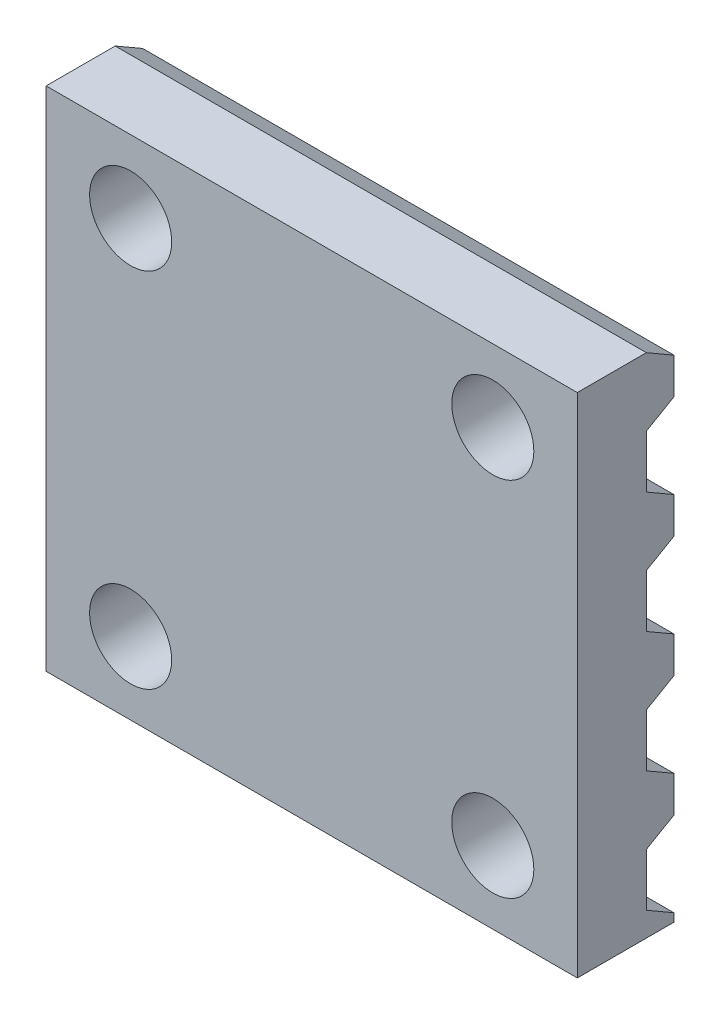
ISO-10303-21;
HEADER;
FILE_DESCRIPTION(('STEP AP214'),'2;1');
FILE_NAME('part.step','',(''),(''),'','','');
FILE_SCHEMA(('AUTOMOTIVE_DESIGN { 1 0 10303 214 1 1 1 1 }'));
ENDSEC;
DATA;
#1=APPLICATION_CONTEXT('core data for automotive mechanical design processes');
#2=APPLICATION_PROTOCOL_DEFINITION('international standard','automotive_design',2000,#1);
#3=PRODUCT_CONTEXT('',#1,'mechanical');
#4=PRODUCT('Part','Part','',(#3));
#5=PRODUCT_RELATED_PRODUCT_CATEGORY('part','',(#4));
#6=PRODUCT_DEFINITION_FORMATION('','',#4);
#7=PRODUCT_DEFINITION_CONTEXT('part definition',#1,'design');
#8=PRODUCT_DEFINITION('design','',#6,#7);
#9=PRODUCT_DEFINITION_SHAPE('','',#8);
#10=(LENGTH_UNIT() NAMED_UNIT(*) SI_UNIT(.MILLI.,.METRE.));
#11=(NAMED_UNIT(*) PLANE_ANGLE_UNIT() SI_UNIT($,.RADIAN.));
#12=(NAMED_UNIT(*) SI_UNIT($,.STERADIAN.) SOLID_ANGLE_UNIT());
#13=UNCERTAINTY_MEASURE_WITH_UNIT(LENGTH_MEASURE(1.E-05),#10,'distance_accuracy_value','');
#14=(GEOMETRIC_REPRESENTATION_CONTEXT(3) GLOBAL_UNCERTAINTY_ASSIGNED_CONTEXT((#13)) GLOBAL_UNIT_ASSIGNED_CONTEXT((#10,
#11,#12)) REPRESENTATION_CONTEXT('',''));
#15=CARTESIAN_POINT('',(0.,0.,0.));
#16=DIRECTION('',(0.,0.,1.));
#17=DIRECTION('',(1.,0.,0.));
#18=AXIS2_PLACEMENT_3D('',#15,#16,#17);
#19=CARTESIAN_POINT('',(-14.0383343860176,-5.48726896031425,-3.16807621135331));
#20=DIRECTION('',(0.,0.866025403784439,0.5));
#21=DIRECTION('',(0.,-0.5,0.866025403784439));
#22=AXIS2_PLACEMENT_3D('',#19,#20,#21);
#23=PLANE('',#22);
#24=DIRECTION('',(1.,0.,0.));
#25=VECTOR('',#24,1.);
#26=CARTESIAN_POINT('',(-14.0383343860176,-7.31635861375234,0.));
#27=LINE('',#26,#25);
#28=CARTESIAN_POINT('',(-5.80994797676017,-7.31635861375234,0.));
#29=VERTEX_POINT('',#28);
#30=CARTESIAN_POINT('',(5.80994797676017,-7.31635861375234,0.));
#31=VERTEX_POINT('',#30);
#32=EDGE_CURVE('E561',#29,#31,#27,.T.);
#33=ORIENTED_EDGE('',*,*,#32,.F.);
#34=CARTESIAN_POINT('',(-7.5,-7.5,0.318076211353326));
#35=DIRECTION('',(0.,0.866025403784439,0.5));
#36=DIRECTION('',(0.,-0.5,0.866025403784439));
#37=AXIS2_PLACEMENT_3D('',#34,#35,#36);
#38=ELLIPSE('',#37,3.4,1.7);
#39=CARTESIAN_POINT('',(-6.02306468637638,-6.65817930687617,-1.14));
#40=VERTEX_POINT('',#39);
#41=EDGE_CURVE('E11',#29,#40,#38,.T.);
#42=ORIENTED_EDGE('',*,*,#41,.T.);
#43=DIRECTION('',(1.,0.,0.));
#44=VECTOR('',#43,1.);
#45=CARTESIAN_POINT('',(-14.0383343860176,-6.65817930687617,-1.14));
#46=LINE('',#45,#44);
#47=CARTESIAN_POINT('',(6.02306468637638,-6.65817930687617,-1.14));
#48=VERTEX_POINT('',#47);
#49=EDGE_CURVE('E347',#40,#48,#46,.T.);
#50=ORIENTED_EDGE('',*,*,#49,.T.);
#51=CARTESIAN_POINT('',(7.5,-7.5,0.318076211353326));
#52=DIRECTION('',(0.,0.866025403784439,0.5));
#53=DIRECTION('',(0.,-0.5,0.866025403784439));
#54=AXIS2_PLACEMENT_3D('',#51,#52,#53);
#55=ELLIPSE('',#54,3.4,1.7);
#56=EDGE_CURVE('E353',#48,#31,#55,.T.);
#57=ORIENTED_EDGE('',*,*,#56,.T.);
#58=EDGE_LOOP('',(#33,#42,#50,#57));
#59=FACE_BOUND('',#58,.T.);
#60=ADVANCED_FACE('F45',(#59),#23,.F.);
#61=CARTESIAN_POINT('',(9.19005202323983,-7.31635861375234,0.));
#62=VERTEX_POINT('',#61);
#63=CARTESIAN_POINT('',(11.,-7.31635861375234,0.));
#64=VERTEX_POINT('',#63);
#65=EDGE_CURVE('E562',#62,#64,#27,.T.);
#66=ORIENTED_EDGE('',*,*,#65,.F.);
#67=CARTESIAN_POINT('',(8.97693531362362,-6.65817930687617,-1.14));
#68=VERTEX_POINT('',#67);
#69=EDGE_CURVE('E446',#62,#68,#55,.T.);
#70=ORIENTED_EDGE('',*,*,#69,.T.);
#71=CARTESIAN_POINT('',(11.,-6.65817930687617,-1.14));
#72=VERTEX_POINT('',#71);
#73=EDGE_CURVE('E349',#68,#72,#46,.T.);
#74=ORIENTED_EDGE('',*,*,#73,.T.);
#75=DIRECTION('',(0.,-0.5,0.866025403784439));
#76=VECTOR('',#75,1.);
#77=CARTESIAN_POINT('',(11.,-5.48726896031425,-3.16807621135331));
#78=LINE('',#77,#76);
#79=EDGE_CURVE('E517',#72,#64,#78,.T.);
#80=ORIENTED_EDGE('',*,*,#79,.T.);
#81=EDGE_LOOP('',(#66,#70,#74,#80));
#82=FACE_BOUND('',#81,.T.);
#83=ADVANCED_FACE('F581',(#82),#23,.F.);
#84=CARTESIAN_POINT('',(-14.0383343860176,5.76273103968574,3.32711431702998));
#85=DIRECTION('',(0.,0.866025403784439,0.5));
#86=DIRECTION('',(0.,-0.5,0.866025403784439));
#87=AXIS2_PLACEMENT_3D('',#84,#85,#86);
#88=PLANE('',#87);
#89=DIRECTION('',(1.,0.,0.));
#90=VECTOR('',#89,1.);
#91=CARTESIAN_POINT('',(-14.0383343860176,7.68364138624765,0.));
#92=LINE('',#91,#90);
#93=CARTESIAN_POINT('',(-5.80994797676017,7.68364138624765,0.));
#94=VERTEX_POINT('',#93);
#95=CARTESIAN_POINT('',(5.80994797676017,7.68364138624765,0.));
#96=VERTEX_POINT('',#95);
#97=EDGE_CURVE('E288',#94,#96,#92,.T.);
#98=ORIENTED_EDGE('',*,*,#97,.F.);
#99=CARTESIAN_POINT('',(-7.5,7.5,0.318076211353322));
#100=DIRECTION('',(0.,0.866025403784439,0.5));
#101=DIRECTION('',(0.,-0.5,0.866025403784439));
#102=AXIS2_PLACEMENT_3D('',#99,#100,#101);
#103=ELLIPSE('',#102,3.4,1.7);
#104=CARTESIAN_POINT('',(-6.02306468637637,8.34182069312383,-1.14));
#105=VERTEX_POINT('',#104);
#106=EDGE_CURVE('E444',#94,#105,#103,.T.);
#107=ORIENTED_EDGE('',*,*,#106,.T.);
#108=DIRECTION('',(1.,0.,0.));
#109=VECTOR('',#108,1.);
#110=CARTESIAN_POINT('',(-14.0383343860176,8.34182069312383,-1.14));
#111=LINE('',#110,#109);
#112=CARTESIAN_POINT('',(6.02306468637638,8.34182069312383,-1.14));
#113=VERTEX_POINT('',#112);
#114=EDGE_CURVE('E267',#105,#113,#111,.T.);
#115=ORIENTED_EDGE('',*,*,#114,.T.);
#116=CARTESIAN_POINT('',(7.5,7.5,0.318076211353322));
#117=DIRECTION('',(0.,0.866025403784439,0.5));
#118=DIRECTION('',(0.,-0.5,0.866025403784439));
#119=AXIS2_PLACEMENT_3D('',#116,#117,#118);
#120=ELLIPSE('',#119,3.4,1.7);
#121=EDGE_CURVE('E243',#113,#96,#120,.T.);
#122=ORIENTED_EDGE('',*,*,#121,.T.);
#123=EDGE_LOOP('',(#98,#107,#115,#122));
#124=FACE_BOUND('',#123,.T.);
#125=ADVANCED_FACE('F452',(#124),#88,.F.);
#126=CARTESIAN_POINT('',(9.19005202323983,7.68364138624765,0.));
#127=VERTEX_POINT('',#126);
#128=CARTESIAN_POINT('',(11.,7.68364138624765,0.));
#129=VERTEX_POINT('',#128);
#130=EDGE_CURVE('E258',#127,#129,#92,.T.);
#131=ORIENTED_EDGE('',*,*,#130,.F.);
#132=CARTESIAN_POINT('',(8.97693531362362,8.34182069312383,-1.14));
#133=VERTEX_POINT('',#132);
#134=EDGE_CURVE('E240',#127,#133,#120,.T.);
#135=ORIENTED_EDGE('',*,*,#134,.T.);
#136=CARTESIAN_POINT('',(11.,8.34182069312383,-1.14));
#137=VERTEX_POINT('',#136);
#138=EDGE_CURVE('E256',#133,#137,#111,.T.);
#139=ORIENTED_EDGE('',*,*,#138,.T.);
#140=DIRECTION('',(0.,-0.5,0.866025403784439));
#141=VECTOR('',#140,1.);
#142=CARTESIAN_POINT('',(11.,5.76273103968574,3.32711431702998));
#143=LINE('',#142,#141);
#144=EDGE_CURVE('E297',#137,#129,#143,.T.);
#145=ORIENTED_EDGE('',*,*,#144,.T.);
#146=EDGE_LOOP('',(#131,#135,#139,#145));
#147=FACE_BOUND('',#146,.T.);
#148=ADVANCED_FACE('F254',(#147),#88,.F.);
#149=CARTESIAN_POINT('',(0.,0.,0.));
#150=DIRECTION('',(0.,0.,-1.));
#151=DIRECTION('',(-1.,0.,0.));
#152=AXIS2_PLACEMENT_3D('',#149,#150,#151);
#153=PLANE('',#152);
#154=CARTESIAN_POINT('',(-7.5,7.5,0.));
#155=DIRECTION('',(0.,0.,-1.));
#156=DIRECTION('',(-1.,0.,0.));
#157=AXIS2_PLACEMENT_3D('',#154,#155,#156);
#158=CIRCLE('',#157,1.7);
#159=CARTESIAN_POINT('',(-9.19005202323983,7.68364138624765,0.));
#160=VERTEX_POINT('',#159);
#161=EDGE_CURVE('E323',#94,#160,#158,.T.);
#162=ORIENTED_EDGE('',*,*,#161,.F.);
#163=ORIENTED_EDGE('',*,*,#97,.T.);
#164=CARTESIAN_POINT('',(7.5,7.5,0.));
#165=DIRECTION('',(0.,0.,-1.));
#166=DIRECTION('',(-1.,0.,0.));
#167=AXIS2_PLACEMENT_3D('',#164,#165,#166);
#168=CIRCLE('',#167,1.7);
#169=EDGE_CURVE('E249',#127,#96,#168,.T.);
#170=ORIENTED_EDGE('',*,*,#169,.F.);
#171=ORIENTED_EDGE('',*,*,#130,.T.);
#172=DIRECTION('',(0.,1.,0.));
#173=VECTOR('',#172,1.);
#174=CARTESIAN_POINT('',(11.,-10.5,0.));
#175=LINE('',#174,#173);
#176=CARTESIAN_POINT('',(11.,5.5,0.));
#177=VERTEX_POINT('',#176);
#178=EDGE_CURVE('E381',#177,#129,#175,.T.);
#179=ORIENTED_EDGE('',*,*,#178,.F.);
#180=DIRECTION('',(1.,0.,0.));
#181=VECTOR('',#180,1.);
#182=CARTESIAN_POINT('',(-14.0383343860176,5.5,0.));
#183=LINE('',#182,#181);
#184=CARTESIAN_POINT('',(-11.,5.5,0.));
#185=VERTEX_POINT('',#184);
#186=EDGE_CURVE('E465',#185,#177,#183,.T.);
#187=ORIENTED_EDGE('',*,*,#186,.F.);
#188=DIRECTION('',(0.,-1.,0.));
#189=VECTOR('',#188,1.);
#190=CARTESIAN_POINT('',(-11.,-10.5,0.));
#191=LINE('',#190,#189);
#192=CARTESIAN_POINT('',(-11.,7.68364138624766,0.));
#193=VERTEX_POINT('',#192);
#194=EDGE_CURVE('E406',#193,#185,#191,.T.);
#195=ORIENTED_EDGE('',*,*,#194,.F.);
#196=EDGE_CURVE('E290',#193,#160,#92,.T.);
#197=ORIENTED_EDGE('',*,*,#196,.T.);
#198=EDGE_LOOP('',(#162,#163,#170,#171,#179,#187,#195,#197));
#199=FACE_BOUND('',#198,.T.);
#200=ADVANCED_FACE('F462',(#199),#153,.T.);
#201=CARTESIAN_POINT('',(-11.,2.68364138624766,0.));
#202=VERTEX_POINT('',#201);
#203=CARTESIAN_POINT('',(-11.,0.5,0.));
#204=VERTEX_POINT('',#203);
#205=EDGE_CURVE('E428',#202,#204,#191,.T.);
#206=ORIENTED_EDGE('',*,*,#205,.F.);
#207=DIRECTION('',(1.,0.,0.));
#208=VECTOR('',#207,1.);
#209=CARTESIAN_POINT('',(-14.0383343860176,2.68364138624766,0.));
#210=LINE('',#209,#208);
#211=CARTESIAN_POINT('',(11.,2.68364138624766,0.));
#212=VERTEX_POINT('',#211);
#213=EDGE_CURVE('E486',#202,#212,#210,.T.);
#214=ORIENTED_EDGE('',*,*,#213,.T.);
#215=CARTESIAN_POINT('',(11.,0.5,0.));
#216=VERTEX_POINT('',#215);
#217=EDGE_CURVE('E590',#216,#212,#175,.T.);
#218=ORIENTED_EDGE('',*,*,#217,.F.);
#219=DIRECTION('',(1.,0.,0.));
#220=VECTOR('',#219,1.);
#221=CARTESIAN_POINT('',(-14.0383343860176,0.5,0.));
#222=LINE('',#221,#220);
#223=EDGE_CURVE('E533',#204,#216,#222,.T.);
#224=ORIENTED_EDGE('',*,*,#223,.F.);
#225=EDGE_LOOP('',(#206,#214,#218,#224));
#226=FACE_BOUND('',#225,.T.);
#227=ADVANCED_FACE('F606',(#226),#153,.T.);
#228=CARTESIAN_POINT('',(-11.,-2.31635861375234,0.));
#229=VERTEX_POINT('',#228);
#230=CARTESIAN_POINT('',(-11.,-4.5,0.));
#231=VERTEX_POINT('',#230);
#232=EDGE_CURVE('E595',#229,#231,#191,.T.);
#233=ORIENTED_EDGE('',*,*,#232,.F.);
#234=DIRECTION('',(1.,0.,0.));
#235=VECTOR('',#234,1.);
#236=CARTESIAN_POINT('',(-14.0383343860176,-2.31635861375234,0.));
#237=LINE('',#236,#235);
#238=CARTESIAN_POINT('',(11.,-2.31635861375234,0.));
#239=VERTEX_POINT('',#238);
#240=EDGE_CURVE('E529',#229,#239,#237,.T.);
#241=ORIENTED_EDGE('',*,*,#240,.T.);
#242=CARTESIAN_POINT('',(11.,-4.5,0.));
#243=VERTEX_POINT('',#242);
#244=EDGE_CURVE('E421',#243,#239,#175,.T.);
#245=ORIENTED_EDGE('',*,*,#244,.F.);
#246=DIRECTION('',(1.,0.,0.));
#247=VECTOR('',#246,1.);
#248=CARTESIAN_POINT('',(-14.0383343860176,-4.5,0.));
#249=LINE('',#248,#247);
#250=EDGE_CURVE('E563',#231,#243,#249,.T.);
#251=ORIENTED_EDGE('',*,*,#250,.F.);
#252=EDGE_LOOP('',(#233,#241,#245,#251));
#253=FACE_BOUND('',#252,.T.);
#254=ADVANCED_FACE('F619',(#253),#153,.T.);
#255=CARTESIAN_POINT('',(-7.5,-7.5,0.));
#256=DIRECTION('',(0.,0.,-1.));
#257=DIRECTION('',(-1.,0.,0.));
#258=AXIS2_PLACEMENT_3D('',#255,#256,#257);
#259=CIRCLE('',#258,1.7);
#260=CARTESIAN_POINT('',(-9.19005202323983,-7.31635861375234,0.));
#261=VERTEX_POINT('',#260);
#262=EDGE_CURVE('E69',#29,#261,#259,.T.);
#263=ORIENTED_EDGE('',*,*,#262,.F.);
#264=ORIENTED_EDGE('',*,*,#32,.T.);
#265=CARTESIAN_POINT('',(7.5,-7.5,0.));
#266=DIRECTION('',(0.,0.,-1.));
#267=DIRECTION('',(-1.,0.,0.));
#268=AXIS2_PLACEMENT_3D('',#265,#266,#267);
#269=CIRCLE('',#268,1.7);
#270=EDGE_CURVE('E61',#62,#31,#269,.T.);
#271=ORIENTED_EDGE('',*,*,#270,.F.);
#272=ORIENTED_EDGE('',*,*,#65,.T.);
#273=CARTESIAN_POINT('',(11.,-9.5,0.));
#274=VERTEX_POINT('',#273);
#275=EDGE_CURVE('E416',#274,#64,#175,.T.);
#276=ORIENTED_EDGE('',*,*,#275,.F.);
#277=DIRECTION('',(1.,0.,0.));
#278=VECTOR('',#277,1.);
#279=CARTESIAN_POINT('',(-14.0383343860176,-9.5,0.));
#280=LINE('',#279,#278);
#281=CARTESIAN_POINT('',(-11.,-9.5,0.));
#282=VERTEX_POINT('',#281);
#283=EDGE_CURVE('E377',#282,#274,#280,.T.);
#284=ORIENTED_EDGE('',*,*,#283,.F.);
#285=CARTESIAN_POINT('',(-11.,-7.31635861375234,0.));
#286=VERTEX_POINT('',#285);
#287=EDGE_CURVE('E425',#286,#282,#191,.T.);
#288=ORIENTED_EDGE('',*,*,#287,.F.);
#289=EDGE_CURVE('E371',#286,#261,#27,.T.);
#290=ORIENTED_EDGE('',*,*,#289,.T.);
#291=EDGE_LOOP('',(#263,#264,#271,#272,#276,#284,#288,#290));
#292=FACE_BOUND('',#291,.T.);
#293=ADVANCED_FACE('F585',(#292),#153,.T.);
#294=CARTESIAN_POINT('',(11.,-10.5,2.86));
#295=DIRECTION('',(-1.,0.,0.));
#296=DIRECTION('',(0.,0.,1.));
#297=AXIS2_PLACEMENT_3D('',#294,#295,#296);
#298=PLANE('',#297);
#299=DIRECTION('',(0.,0.,-1.));
#300=VECTOR('',#299,1.);
#301=CARTESIAN_POINT('',(11.,-10.5,2.86));
#302=LINE('',#301,#300);
#303=CARTESIAN_POINT('',(11.,-10.5,2.86));
#304=VERTEX_POINT('',#303);
#305=CARTESIAN_POINT('',(11.,-10.5,-1.14));
#306=VERTEX_POINT('',#305);
#307=EDGE_CURVE('E415',#304,#306,#302,.T.);
#308=ORIENTED_EDGE('',*,*,#307,.T.);
#309=DIRECTION('',(0.,-1.,0.));
#310=VECTOR('',#309,1.);
#311=CARTESIAN_POINT('',(11.,0.,-1.14));
#312=LINE('',#311,#310);
#313=CARTESIAN_POINT('',(11.,-10.1581793068762,-1.14));
#314=VERTEX_POINT('',#313);
#315=EDGE_CURVE('E382',#314,#306,#312,.T.);
#316=ORIENTED_EDGE('',*,*,#315,.F.);
#317=DIRECTION('',(0.,-0.499999999999997,-0.86602540378444));
#318=VECTOR('',#317,1.);
#319=CARTESIAN_POINT('',(11.,-7.12500000000003,4.11362066797607));
#320=LINE('',#319,#318);
#321=EDGE_CURVE('E386',#274,#314,#320,.T.);
#322=ORIENTED_EDGE('',*,*,#321,.F.);
#323=ORIENTED_EDGE('',*,*,#275,.T.);
#324=ORIENTED_EDGE('',*,*,#79,.F.);
#325=DIRECTION('',(0.,-1.,0.));
#326=VECTOR('',#325,1.);
#327=CARTESIAN_POINT('',(11.,0.,-1.14));
#328=LINE('',#327,#326);
#329=CARTESIAN_POINT('',(11.,-5.15817930687617,-1.14));
#330=VERTEX_POINT('',#329);
#331=EDGE_CURVE('E553',#330,#72,#328,.T.);
#332=ORIENTED_EDGE('',*,*,#331,.F.);
#333=DIRECTION('',(0.,-0.499999999999997,-0.86602540378444));
#334=VECTOR('',#333,1.);
#335=CARTESIAN_POINT('',(11.,-3.37500000000001,1.94855715851498));
#336=LINE('',#335,#334);
#337=EDGE_CURVE('E362',#243,#330,#336,.T.);
#338=ORIENTED_EDGE('',*,*,#337,.F.);
#339=ORIENTED_EDGE('',*,*,#244,.T.);
#340=DIRECTION('',(0.,-0.5,0.866025403784439));
#341=VECTOR('',#340,1.);
#342=CARTESIAN_POINT('',(11.,-1.73726896031426,-1.00301270189222));
#343=LINE('',#342,#341);
#344=CARTESIAN_POINT('',(11.,-1.65817930687617,-1.14));
#345=VERTEX_POINT('',#344);
#346=EDGE_CURVE('E484',#345,#239,#343,.T.);
#347=ORIENTED_EDGE('',*,*,#346,.F.);
#348=DIRECTION('',(0.,-1.,0.));
#349=VECTOR('',#348,1.);
#350=CARTESIAN_POINT('',(11.,0.,-1.14));
#351=LINE('',#350,#349);
#352=CARTESIAN_POINT('',(11.,-0.158179306876168,-1.14));
#353=VERTEX_POINT('',#352);
#354=EDGE_CURVE('E520',#353,#345,#351,.T.);
#355=ORIENTED_EDGE('',*,*,#354,.F.);
#356=DIRECTION('',(0.,-0.499999999999997,-0.86602540378444));
#357=VECTOR('',#356,1.);
#358=CARTESIAN_POINT('',(11.,0.375000000000002,-0.216506350946109));
#359=LINE('',#358,#357);
#360=EDGE_CURVE('E524',#216,#353,#359,.T.);
#361=ORIENTED_EDGE('',*,*,#360,.F.);
#362=ORIENTED_EDGE('',*,*,#217,.T.);
#363=DIRECTION('',(0.,-0.5,0.866025403784439));
#364=VECTOR('',#363,1.);
#365=CARTESIAN_POINT('',(11.,2.01273103968574,1.16205080756888));
#366=LINE('',#365,#364);
#367=CARTESIAN_POINT('',(11.,3.34182069312383,-1.14));
#368=VERTEX_POINT('',#367);
#369=EDGE_CURVE('E304',#368,#212,#366,.T.);
#370=ORIENTED_EDGE('',*,*,#369,.F.);
#371=DIRECTION('',(0.,-1.,0.));
#372=VECTOR('',#371,1.);
#373=CARTESIAN_POINT('',(11.,0.,-1.14));
#374=LINE('',#373,#372);
#375=CARTESIAN_POINT('',(11.,4.84182069312383,-1.14));
#376=VERTEX_POINT('',#375);
#377=EDGE_CURVE('E491',#376,#368,#374,.T.);
#378=ORIENTED_EDGE('',*,*,#377,.F.);
#379=DIRECTION('',(0.,-0.499999999999997,-0.86602540378444));
#380=VECTOR('',#379,1.);
#381=CARTESIAN_POINT('',(11.,4.12500000000002,-2.3815698604072));
#382=LINE('',#381,#380);
#383=EDGE_CURVE('E495',#177,#376,#382,.T.);
#384=ORIENTED_EDGE('',*,*,#383,.F.);
#385=ORIENTED_EDGE('',*,*,#178,.T.);
#386=ORIENTED_EDGE('',*,*,#144,.F.);
#387=DIRECTION('',(0.,-1.,0.));
#388=VECTOR('',#387,1.);
#389=CARTESIAN_POINT('',(11.,0.,-1.14));
#390=LINE('',#389,#388);
#391=CARTESIAN_POINT('',(11.,9.84182069312383,-1.14));
#392=VERTEX_POINT('',#391);
#393=EDGE_CURVE('E264',#392,#137,#390,.T.);
#394=ORIENTED_EDGE('',*,*,#393,.F.);
#395=DIRECTION('',(0.,-0.499999999999997,-0.86602540378444));
#396=VECTOR('',#395,1.);
#397=CARTESIAN_POINT('',(11.,7.87500000000003,-4.54663336986829));
#398=LINE('',#397,#396);
#399=CARTESIAN_POINT('',(11.,10.5,0.));
#400=VERTEX_POINT('',#399);
#401=EDGE_CURVE('E268',#400,#392,#398,.T.);
#402=ORIENTED_EDGE('',*,*,#401,.F.);
#403=DIRECTION('',(0.,0.,-1.));
#404=VECTOR('',#403,1.);
#405=CARTESIAN_POINT('',(11.,10.5,2.86));
#406=LINE('',#405,#404);
#407=CARTESIAN_POINT('',(11.,10.5,2.86));
#408=VERTEX_POINT('',#407);
#409=EDGE_CURVE('E438',#408,#400,#406,.T.);
#410=ORIENTED_EDGE('',*,*,#409,.F.);
#411=DIRECTION('',(0.,1.,0.));
#412=VECTOR('',#411,1.);
#413=CARTESIAN_POINT('',(11.,-10.5,2.86));
#414=LINE('',#413,#412);
#415=EDGE_CURVE('E401',#304,#408,#414,.T.);
#416=ORIENTED_EDGE('',*,*,#415,.F.);
#417=EDGE_LOOP('',(#308,#316,#322,#323,#324,#332,#338,#339,#347,#355,#361,#362,#370,#378,#384,
#385,#386,#394,#402,#410,#416));
#418=FACE_BOUND('',#417,.T.);
#419=ADVANCED_FACE('F47',(#418),#298,.F.);
#420=CARTESIAN_POINT('',(-11.,10.5,2.86));
#421=DIRECTION('',(0.,-1.,0.));
#422=DIRECTION('',(0.,0.,-1.));
#423=AXIS2_PLACEMENT_3D('',#420,#421,#422);
#424=PLANE('',#423);
#425=DIRECTION('',(-1.,0.,0.));
#426=VECTOR('',#425,1.);
#427=CARTESIAN_POINT('',(-11.,10.5,0.));
#428=LINE('',#427,#426);
#429=CARTESIAN_POINT('',(-11.,10.5,0.));
#430=VERTEX_POINT('',#429);
#431=EDGE_CURVE('E420',#400,#430,#428,.T.);
#432=ORIENTED_EDGE('',*,*,#431,.T.);
#433=DIRECTION('',(0.,0.,-1.));
#434=VECTOR('',#433,1.);
#435=CARTESIAN_POINT('',(-11.,10.5,2.86));
#436=LINE('',#435,#434);
#437=CARTESIAN_POINT('',(-11.,10.5,2.86));
#438=VERTEX_POINT('',#437);
#439=EDGE_CURVE('E434',#438,#430,#436,.T.);
#440=ORIENTED_EDGE('',*,*,#439,.F.);
#441=DIRECTION('',(-1.,0.,0.));
#442=VECTOR('',#441,1.);
#443=CARTESIAN_POINT('',(-11.,10.5,2.86));
#444=LINE('',#443,#442);
#445=EDGE_CURVE('E405',#408,#438,#444,.T.);
#446=ORIENTED_EDGE('',*,*,#445,.F.);
#447=ORIENTED_EDGE('',*,*,#409,.T.);
#448=EDGE_LOOP('',(#432,#440,#446,#447));
#449=FACE_BOUND('',#448,.T.);
#450=ADVANCED_FACE('F648',(#449),#424,.F.);
#451=CARTESIAN_POINT('',(-11.,-10.5,2.86));
#452=DIRECTION('',(1.,0.,0.));
#453=DIRECTION('',(0.,0.,-1.));
#454=AXIS2_PLACEMENT_3D('',#451,#452,#453);
#455=PLANE('',#454);
#456=ORIENTED_EDGE('',*,*,#439,.T.);
#457=DIRECTION('',(0.,0.499999999999997,0.86602540378444));
#458=VECTOR('',#457,1.);
#459=CARTESIAN_POINT('',(-11.,7.87500000000003,-4.54663336986829));
#460=LINE('',#459,#458);
#461=CARTESIAN_POINT('',(-11.,9.84182069312383,-1.14));
#462=VERTEX_POINT('',#461);
#463=EDGE_CURVE('E305',#462,#430,#460,.T.);
#464=ORIENTED_EDGE('',*,*,#463,.F.);
#465=DIRECTION('',(0.,1.,0.));
#466=VECTOR('',#465,1.);
#467=CARTESIAN_POINT('',(-11.,0.,-1.14));
#468=LINE('',#467,#466);
#469=CARTESIAN_POINT('',(-11.,8.34182069312383,-1.14));
#470=VERTEX_POINT('',#469);
#471=EDGE_CURVE('E293',#470,#462,#468,.T.);
#472=ORIENTED_EDGE('',*,*,#471,.F.);
#473=DIRECTION('',(0.,0.5,-0.866025403784439));
#474=VECTOR('',#473,1.);
#475=CARTESIAN_POINT('',(-11.,5.76273103968574,3.32711431702998));
#476=LINE('',#475,#474);
#477=EDGE_CURVE('E301',#193,#470,#476,.T.);
#478=ORIENTED_EDGE('',*,*,#477,.F.);
#479=ORIENTED_EDGE('',*,*,#194,.T.);
#480=DIRECTION('',(0.,0.499999999999997,0.86602540378444));
#481=VECTOR('',#480,1.);
#482=CARTESIAN_POINT('',(-11.,4.12500000000002,-2.3815698604072));
#483=LINE('',#482,#481);
#484=CARTESIAN_POINT('',(-11.,4.84182069312383,-1.14));
#485=VERTEX_POINT('',#484);
#486=EDGE_CURVE('E469',#485,#185,#483,.T.);
#487=ORIENTED_EDGE('',*,*,#486,.F.);
#488=DIRECTION('',(0.,1.,0.));
#489=VECTOR('',#488,1.);
#490=CARTESIAN_POINT('',(-11.,0.,-1.14));
#491=LINE('',#490,#489);
#492=CARTESIAN_POINT('',(-11.,3.34182069312383,-1.14));
#493=VERTEX_POINT('',#492);
#494=EDGE_CURVE('E479',#493,#485,#491,.T.);
#495=ORIENTED_EDGE('',*,*,#494,.F.);
#496=DIRECTION('',(0.,0.5,-0.866025403784439));
#497=VECTOR('',#496,1.);
#498=CARTESIAN_POINT('',(-11.,2.01273103968574,1.16205080756888));
#499=LINE('',#498,#497);
#500=EDGE_CURVE('E478',#202,#493,#499,.T.);
#501=ORIENTED_EDGE('',*,*,#500,.F.);
#502=ORIENTED_EDGE('',*,*,#205,.T.);
#503=DIRECTION('',(0.,0.499999999999997,0.86602540378444));
#504=VECTOR('',#503,1.);
#505=CARTESIAN_POINT('',(-11.,0.375000000000002,-0.216506350946109));
#506=LINE('',#505,#504);
#507=CARTESIAN_POINT('',(-11.,-0.158179306876168,-1.14));
#508=VERTEX_POINT('',#507);
#509=EDGE_CURVE('E508',#508,#204,#506,.T.);
#510=ORIENTED_EDGE('',*,*,#509,.F.);
#511=DIRECTION('',(0.,1.,0.));
#512=VECTOR('',#511,1.);
#513=CARTESIAN_POINT('',(-11.,0.,-1.14));
#514=LINE('',#513,#512);
#515=CARTESIAN_POINT('',(-11.,-1.65817930687617,-1.14));
#516=VERTEX_POINT('',#515);
#517=EDGE_CURVE('E513',#516,#508,#514,.T.);
#518=ORIENTED_EDGE('',*,*,#517,.F.);
#519=DIRECTION('',(0.,0.5,-0.866025403784439));
#520=VECTOR('',#519,1.);
#521=CARTESIAN_POINT('',(-11.,-1.73726896031426,-1.00301270189222));
#522=LINE('',#521,#520);
#523=EDGE_CURVE('E512',#229,#516,#522,.T.);
#524=ORIENTED_EDGE('',*,*,#523,.F.);
#525=ORIENTED_EDGE('',*,*,#232,.T.);
#526=DIRECTION('',(0.,0.499999999999997,0.86602540378444));
#527=VECTOR('',#526,1.);
#528=CARTESIAN_POINT('',(-11.,-3.37500000000001,1.94855715851498));
#529=LINE('',#528,#527);
#530=CARTESIAN_POINT('',(-11.,-5.15817930687617,-1.14));
#531=VERTEX_POINT('',#530);
#532=EDGE_CURVE('E370',#531,#231,#529,.T.);
#533=ORIENTED_EDGE('',*,*,#532,.F.);
#534=DIRECTION('',(0.,1.,0.));
#535=VECTOR('',#534,1.);
#536=CARTESIAN_POINT('',(-11.,0.,-1.14));
#537=LINE('',#536,#535);
#538=CARTESIAN_POINT('',(-11.,-6.65817930687617,-1.14));
#539=VERTEX_POINT('',#538);
#540=EDGE_CURVE('E366',#539,#531,#537,.T.);
#541=ORIENTED_EDGE('',*,*,#540,.F.);
#542=DIRECTION('',(0.,0.5,-0.866025403784439));
#543=VECTOR('',#542,1.);
#544=CARTESIAN_POINT('',(-11.,-5.48726896031425,-3.16807621135331));
#545=LINE('',#544,#543);
#546=EDGE_CURVE('E387',#286,#539,#545,.T.);
#547=ORIENTED_EDGE('',*,*,#546,.F.);
#548=ORIENTED_EDGE('',*,*,#287,.T.);
#549=DIRECTION('',(0.,0.499999999999997,0.86602540378444));
#550=VECTOR('',#549,1.);
#551=CARTESIAN_POINT('',(-11.,-7.12500000000003,4.11362066797607));
#552=LINE('',#551,#550);
#553=CARTESIAN_POINT('',(-11.,-10.1581793068762,-1.14));
#554=VERTEX_POINT('',#553);
#555=EDGE_CURVE('E376',#554,#282,#552,.T.);
#556=ORIENTED_EDGE('',*,*,#555,.F.);
#557=DIRECTION('',(0.,1.,0.));
#558=VECTOR('',#557,1.);
#559=CARTESIAN_POINT('',(-11.,0.,-1.14));
#560=LINE('',#559,#558);
#561=CARTESIAN_POINT('',(-11.,-10.5,-1.14));
#562=VERTEX_POINT('',#561);
#563=EDGE_CURVE('E372',#562,#554,#560,.T.);
#564=ORIENTED_EDGE('',*,*,#563,.F.);
#565=DIRECTION('',(0.,0.,-1.));
#566=VECTOR('',#565,1.);
#567=CARTESIAN_POINT('',(-11.,-10.5,2.86));
#568=LINE('',#567,#566);
#569=CARTESIAN_POINT('',(-11.,-10.5,2.86));
#570=VERTEX_POINT('',#569);
#571=EDGE_CURVE('E431',#570,#562,#568,.T.);
#572=ORIENTED_EDGE('',*,*,#571,.F.);
#573=DIRECTION('',(0.,-1.,0.));
#574=VECTOR('',#573,1.);
#575=CARTESIAN_POINT('',(-11.,-10.5,2.86));
#576=LINE('',#575,#574);
#577=EDGE_CURVE('E409',#438,#570,#576,.T.);
#578=ORIENTED_EDGE('',*,*,#577,.F.);
#579=EDGE_LOOP('',(#456,#464,#472,#478,#479,#487,#495,#501,#502,#510,#518,#524,#525,#533,#541,
#547,#548,#556,#564,#572,#578));
#580=FACE_BOUND('',#579,.T.);
#581=ADVANCED_FACE('F468',(#580),#455,.F.);
#582=CARTESIAN_POINT('',(-11.,-10.5,2.86));
#583=DIRECTION('',(0.,1.,0.));
#584=DIRECTION('',(0.,0.,1.));
#585=AXIS2_PLACEMENT_3D('',#582,#583,#584);
#586=PLANE('',#585);
#587=ORIENTED_EDGE('',*,*,#571,.T.);
#588=DIRECTION('',(1.,0.,0.));
#589=VECTOR('',#588,1.);
#590=CARTESIAN_POINT('',(-14.0383343860176,-10.5,-1.14));
#591=LINE('',#590,#589);
#592=EDGE_CURVE('E391',#562,#306,#591,.T.);
#593=ORIENTED_EDGE('',*,*,#592,.T.);
#594=ORIENTED_EDGE('',*,*,#307,.F.);
#595=DIRECTION('',(1.,0.,0.));
#596=VECTOR('',#595,1.);
#597=CARTESIAN_POINT('',(-11.,-10.5,2.86));
#598=LINE('',#597,#596);
#599=EDGE_CURVE('E412',#570,#304,#598,.T.);
#600=ORIENTED_EDGE('',*,*,#599,.F.);
#601=EDGE_LOOP('',(#587,#593,#594,#600));
#602=FACE_BOUND('',#601,.T.);
#603=ADVANCED_FACE('F642',(#602),#586,.F.);
#604=CARTESIAN_POINT('',(0.,0.,2.86));
#605=DIRECTION('',(0.,0.,-1.));
#606=DIRECTION('',(-1.,0.,0.));
#607=AXIS2_PLACEMENT_3D('',#604,#605,#606);
#608=PLANE('',#607);
#609=CARTESIAN_POINT('',(-7.5,7.5,2.86));
#610=DIRECTION('',(0.,0.,-1.));
#611=DIRECTION('',(-1.,0.,0.));
#612=AXIS2_PLACEMENT_3D('',#609,#610,#611);
#613=CIRCLE('',#612,1.7);
#614=CARTESIAN_POINT('',(-9.2,7.5,2.86));
#615=VERTEX_POINT('',#614);
#616=EDGE_CURVE('E319',#615,#615,#613,.T.);
#617=ORIENTED_EDGE('',*,*,#616,.T.);
#618=EDGE_LOOP('',(#617));
#619=FACE_BOUND('',#618,.T.);
#620=CARTESIAN_POINT('',(-7.5,-7.5,2.86));
#621=DIRECTION('',(0.,0.,-1.));
#622=DIRECTION('',(-1.,0.,0.));
#623=AXIS2_PLACEMENT_3D('',#620,#621,#622);
#624=CIRCLE('',#623,1.7);
#625=CARTESIAN_POINT('',(-9.2,-7.5,2.86));
#626=VERTEX_POINT('',#625);
#627=EDGE_CURVE('E300',#626,#626,#624,.T.);
#628=ORIENTED_EDGE('',*,*,#627,.T.);
#629=EDGE_LOOP('',(#628));
#630=FACE_BOUND('',#629,.T.);
#631=CARTESIAN_POINT('',(7.5,-7.5,2.86));
#632=DIRECTION('',(0.,0.,-1.));
#633=DIRECTION('',(-1.,0.,0.));
#634=AXIS2_PLACEMENT_3D('',#631,#632,#633);
#635=CIRCLE('',#634,1.7);
#636=CARTESIAN_POINT('',(5.8,-7.5,2.86));
#637=VERTEX_POINT('',#636);
#638=EDGE_CURVE('E313',#637,#637,#635,.T.);
#639=ORIENTED_EDGE('',*,*,#638,.T.);
#640=EDGE_LOOP('',(#639));
#641=FACE_BOUND('',#640,.T.);
#642=CARTESIAN_POINT('',(7.5,7.5,2.86));
#643=DIRECTION('',(0.,0.,-1.));
#644=DIRECTION('',(-1.,0.,0.));
#645=AXIS2_PLACEMENT_3D('',#642,#643,#644);
#646=CIRCLE('',#645,1.7);
#647=CARTESIAN_POINT('',(5.8,7.5,2.86));
#648=VERTEX_POINT('',#647);
#649=EDGE_CURVE('E326',#648,#648,#646,.T.);
#650=ORIENTED_EDGE('',*,*,#649,.T.);
#651=EDGE_LOOP('',(#650));
#652=FACE_BOUND('',#651,.T.);
#653=ORIENTED_EDGE('',*,*,#415,.T.);
#654=ORIENTED_EDGE('',*,*,#445,.T.);
#655=ORIENTED_EDGE('',*,*,#577,.T.);
#656=ORIENTED_EDGE('',*,*,#599,.T.);
#657=EDGE_LOOP('',(#653,#654,#655,#656));
#658=FACE_BOUND('',#657,.T.);
#659=ADVANCED_FACE('F646',(#619,#630,#641,#652,#658),#608,.F.);
#660=CARTESIAN_POINT('',(-14.0383343860176,-7.12500000000003,4.11362066797607));
#661=DIRECTION('',(0.,-0.86602540378444,0.499999999999997));
#662=DIRECTION('',(0.,-0.499999999999997,-0.86602540378444));
#663=AXIS2_PLACEMENT_3D('',#660,#661,#662);
#664=PLANE('',#663);
#665=DIRECTION('',(1.,0.,0.));
#666=VECTOR('',#665,1.);
#667=CARTESIAN_POINT('',(-14.0383343860176,-10.1581793068762,-1.14));
#668=LINE('',#667,#666);
#669=EDGE_CURVE('E395',#554,#314,#668,.T.);
#670=ORIENTED_EDGE('',*,*,#669,.F.);
#671=ORIENTED_EDGE('',*,*,#555,.T.);
#672=ORIENTED_EDGE('',*,*,#283,.T.);
#673=ORIENTED_EDGE('',*,*,#321,.T.);
#674=EDGE_LOOP('',(#670,#671,#672,#673));
#675=FACE_BOUND('',#674,.T.);
#676=ADVANCED_FACE('F635',(#675),#664,.F.);
#677=CARTESIAN_POINT('',(-14.0383343860176,0.,-1.14));
#678=DIRECTION('',(0.,0.,1.));
#679=DIRECTION('',(1.,0.,0.));
#680=AXIS2_PLACEMENT_3D('',#677,#678,#679);
#681=PLANE('',#680);
#682=ORIENTED_EDGE('',*,*,#592,.F.);
#683=ORIENTED_EDGE('',*,*,#563,.T.);
#684=ORIENTED_EDGE('',*,*,#669,.T.);
#685=ORIENTED_EDGE('',*,*,#315,.T.);
#686=EDGE_LOOP('',(#682,#683,#684,#685));
#687=FACE_BOUND('',#686,.T.);
#688=ADVANCED_FACE('F634',(#687),#681,.F.);
#689=CARTESIAN_POINT('',(-14.0383343860176,0.,-1.14));
#690=DIRECTION('',(0.,0.,1.));
#691=DIRECTION('',(1.,0.,0.));
#692=AXIS2_PLACEMENT_3D('',#689,#690,#691);
#693=PLANE('',#692);
#694=ORIENTED_EDGE('',*,*,#49,.F.);
#695=CARTESIAN_POINT('',(-7.5,-7.5,-1.14));
#696=DIRECTION('',(0.,0.,1.));
#697=DIRECTION('',(1.,0.,0.));
#698=AXIS2_PLACEMENT_3D('',#695,#696,#697);
#699=CIRCLE('',#698,1.7);
#700=CARTESIAN_POINT('',(-8.97693531362362,-6.65817930687617,-1.14));
#701=VERTEX_POINT('',#700);
#702=EDGE_CURVE('E336',#40,#701,#699,.T.);
#703=ORIENTED_EDGE('',*,*,#702,.T.);
#704=EDGE_CURVE('E356',#539,#701,#46,.T.);
#705=ORIENTED_EDGE('',*,*,#704,.F.);
#706=ORIENTED_EDGE('',*,*,#540,.T.);
#707=DIRECTION('',(1.,0.,0.));
#708=VECTOR('',#707,1.);
#709=CARTESIAN_POINT('',(-14.0383343860176,-5.15817930687617,-1.14));
#710=LINE('',#709,#708);
#711=EDGE_CURVE('E361',#531,#330,#710,.T.);
#712=ORIENTED_EDGE('',*,*,#711,.T.);
#713=ORIENTED_EDGE('',*,*,#331,.T.);
#714=ORIENTED_EDGE('',*,*,#73,.F.);
#715=CARTESIAN_POINT('',(7.5,-7.5,-1.14));
#716=DIRECTION('',(0.,0.,1.));
#717=DIRECTION('',(1.,0.,0.));
#718=AXIS2_PLACEMENT_3D('',#715,#716,#717);
#719=CIRCLE('',#718,1.7);
#720=EDGE_CURVE('E250',#68,#48,#719,.T.);
#721=ORIENTED_EDGE('',*,*,#720,.T.);
#722=EDGE_LOOP('',(#694,#703,#705,#706,#712,#713,#714,#721));
#723=FACE_BOUND('',#722,.T.);
#724=ADVANCED_FACE('F346',(#723),#693,.F.);
#725=CARTESIAN_POINT('',(-14.0383343860176,-3.37500000000001,1.94855715851498));
#726=DIRECTION('',(0.,-0.86602540378444,0.499999999999997));
#727=DIRECTION('',(0.,-0.499999999999997,-0.86602540378444));
#728=AXIS2_PLACEMENT_3D('',#725,#726,#727);
#729=PLANE('',#728);
#730=ORIENTED_EDGE('',*,*,#711,.F.);
#731=ORIENTED_EDGE('',*,*,#532,.T.);
#732=ORIENTED_EDGE('',*,*,#250,.T.);
#733=ORIENTED_EDGE('',*,*,#337,.T.);
#734=EDGE_LOOP('',(#730,#731,#732,#733));
#735=FACE_BOUND('',#734,.T.);
#736=ADVANCED_FACE('F574',(#735),#729,.F.);
#737=ORIENTED_EDGE('',*,*,#704,.T.);
#738=EDGE_CURVE('E49',#701,#261,#38,.T.);
#739=ORIENTED_EDGE('',*,*,#738,.T.);
#740=ORIENTED_EDGE('',*,*,#289,.F.);
#741=ORIENTED_EDGE('',*,*,#546,.T.);
#742=EDGE_LOOP('',(#737,#739,#740,#741));
#743=FACE_BOUND('',#742,.T.);
#744=ADVANCED_FACE('F623',(#743),#23,.F.);
#745=CARTESIAN_POINT('',(-14.0383343860176,0.,-1.14));
#746=DIRECTION('',(0.,0.,1.));
#747=DIRECTION('',(1.,0.,0.));
#748=AXIS2_PLACEMENT_3D('',#745,#746,#747);
#749=PLANE('',#748);
#750=DIRECTION('',(1.,0.,0.));
#751=VECTOR('',#750,1.);
#752=CARTESIAN_POINT('',(-14.0383343860176,-1.65817930687617,-1.14));
#753=LINE('',#752,#751);
#754=EDGE_CURVE('E528',#516,#345,#753,.T.);
#755=ORIENTED_EDGE('',*,*,#754,.F.);
#756=ORIENTED_EDGE('',*,*,#517,.T.);
#757=DIRECTION('',(1.,0.,0.));
#758=VECTOR('',#757,1.);
#759=CARTESIAN_POINT('',(-14.0383343860176,-0.158179306876168,-1.14));
#760=LINE('',#759,#758);
#761=EDGE_CURVE('E536',#508,#353,#760,.T.);
#762=ORIENTED_EDGE('',*,*,#761,.T.);
#763=ORIENTED_EDGE('',*,*,#354,.T.);
#764=EDGE_LOOP('',(#755,#756,#762,#763));
#765=FACE_BOUND('',#764,.T.);
#766=ADVANCED_FACE('F613',(#765),#749,.F.);
#767=CARTESIAN_POINT('',(-14.0383343860176,0.375000000000002,-0.216506350946109));
#768=DIRECTION('',(0.,-0.86602540378444,0.499999999999997));
#769=DIRECTION('',(0.,-0.499999999999997,-0.86602540378444));
#770=AXIS2_PLACEMENT_3D('',#767,#768,#769);
#771=PLANE('',#770);
#772=ORIENTED_EDGE('',*,*,#761,.F.);
#773=ORIENTED_EDGE('',*,*,#509,.T.);
#774=ORIENTED_EDGE('',*,*,#223,.T.);
#775=ORIENTED_EDGE('',*,*,#360,.T.);
#776=EDGE_LOOP('',(#772,#773,#774,#775));
#777=FACE_BOUND('',#776,.T.);
#778=ADVANCED_FACE('F603',(#777),#771,.F.);
#779=CARTESIAN_POINT('',(-14.0383343860176,-1.73726896031426,-1.00301270189222));
#780=DIRECTION('',(0.,0.866025403784439,0.5));
#781=DIRECTION('',(0.,-0.5,0.866025403784439));
#782=AXIS2_PLACEMENT_3D('',#779,#780,#781);
#783=PLANE('',#782);
#784=ORIENTED_EDGE('',*,*,#240,.F.);
#785=ORIENTED_EDGE('',*,*,#523,.T.);
#786=ORIENTED_EDGE('',*,*,#754,.T.);
#787=ORIENTED_EDGE('',*,*,#346,.T.);
#788=EDGE_LOOP('',(#784,#785,#786,#787));
#789=FACE_BOUND('',#788,.T.);
#790=ADVANCED_FACE('F617',(#789),#783,.F.);
#791=CARTESIAN_POINT('',(-14.0383343860176,0.,-1.14));
#792=DIRECTION('',(0.,0.,1.));
#793=DIRECTION('',(1.,0.,0.));
#794=AXIS2_PLACEMENT_3D('',#791,#792,#793);
#795=PLANE('',#794);
#796=DIRECTION('',(1.,0.,0.));
#797=VECTOR('',#796,1.);
#798=CARTESIAN_POINT('',(-14.0383343860176,3.34182069312383,-1.14));
#799=LINE('',#798,#797);
#800=EDGE_CURVE('E498',#493,#368,#799,.T.);
#801=ORIENTED_EDGE('',*,*,#800,.F.);
#802=ORIENTED_EDGE('',*,*,#494,.T.);
#803=DIRECTION('',(1.,0.,0.));
#804=VECTOR('',#803,1.);
#805=CARTESIAN_POINT('',(-14.0383343860176,4.84182069312383,-1.14));
#806=LINE('',#805,#804);
#807=EDGE_CURVE('E475',#485,#376,#806,.T.);
#808=ORIENTED_EDGE('',*,*,#807,.T.);
#809=ORIENTED_EDGE('',*,*,#377,.T.);
#810=EDGE_LOOP('',(#801,#802,#808,#809));
#811=FACE_BOUND('',#810,.T.);
#812=ADVANCED_FACE('F656',(#811),#795,.F.);
#813=CARTESIAN_POINT('',(-14.0383343860176,4.12500000000002,-2.3815698604072));
#814=DIRECTION('',(0.,-0.86602540378444,0.499999999999997));
#815=DIRECTION('',(0.,-0.499999999999997,-0.86602540378444));
#816=AXIS2_PLACEMENT_3D('',#813,#814,#815);
#817=PLANE('',#816);
#818=ORIENTED_EDGE('',*,*,#807,.F.);
#819=ORIENTED_EDGE('',*,*,#486,.T.);
#820=ORIENTED_EDGE('',*,*,#186,.T.);
#821=ORIENTED_EDGE('',*,*,#383,.T.);
#822=EDGE_LOOP('',(#818,#819,#820,#821));
#823=FACE_BOUND('',#822,.T.);
#824=ADVANCED_FACE('F472',(#823),#817,.F.);
#825=CARTESIAN_POINT('',(-14.0383343860176,2.01273103968574,1.16205080756888));
#826=DIRECTION('',(0.,0.866025403784439,0.5));
#827=DIRECTION('',(0.,-0.5,0.866025403784439));
#828=AXIS2_PLACEMENT_3D('',#825,#826,#827);
#829=PLANE('',#828);
#830=ORIENTED_EDGE('',*,*,#213,.F.);
#831=ORIENTED_EDGE('',*,*,#500,.T.);
#832=ORIENTED_EDGE('',*,*,#800,.T.);
#833=ORIENTED_EDGE('',*,*,#369,.T.);
#834=EDGE_LOOP('',(#830,#831,#832,#833));
#835=FACE_BOUND('',#834,.T.);
#836=ADVANCED_FACE('F658',(#835),#829,.F.);
#837=CARTESIAN_POINT('',(-14.0383343860176,0.,-1.14));
#838=DIRECTION('',(0.,0.,1.));
#839=DIRECTION('',(1.,0.,0.));
#840=AXIS2_PLACEMENT_3D('',#837,#838,#839);
#841=PLANE('',#840);
#842=ORIENTED_EDGE('',*,*,#114,.F.);
#843=CARTESIAN_POINT('',(-7.5,7.5,-1.14));
#844=DIRECTION('',(0.,0.,1.));
#845=DIRECTION('',(1.,0.,0.));
#846=AXIS2_PLACEMENT_3D('',#843,#844,#845);
#847=CIRCLE('',#846,1.7);
#848=CARTESIAN_POINT('',(-8.97693531362363,8.34182069312383,-1.14));
#849=VERTEX_POINT('',#848);
#850=EDGE_CURVE('E332',#105,#849,#847,.T.);
#851=ORIENTED_EDGE('',*,*,#850,.T.);
#852=EDGE_CURVE('E270',#470,#849,#111,.T.);
#853=ORIENTED_EDGE('',*,*,#852,.F.);
#854=ORIENTED_EDGE('',*,*,#471,.T.);
#855=DIRECTION('',(1.,0.,0.));
#856=VECTOR('',#855,1.);
#857=CARTESIAN_POINT('',(-14.0383343860176,9.84182069312383,-1.14));
#858=LINE('',#857,#856);
#859=EDGE_CURVE('E279',#462,#392,#858,.T.);
#860=ORIENTED_EDGE('',*,*,#859,.T.);
#861=ORIENTED_EDGE('',*,*,#393,.T.);
#862=ORIENTED_EDGE('',*,*,#138,.F.);
#863=CARTESIAN_POINT('',(7.5,7.5,-1.14));
#864=DIRECTION('',(0.,0.,1.));
#865=DIRECTION('',(1.,0.,0.));
#866=AXIS2_PLACEMENT_3D('',#863,#864,#865);
#867=CIRCLE('',#866,1.7);
#868=EDGE_CURVE('E236',#133,#113,#867,.T.);
#869=ORIENTED_EDGE('',*,*,#868,.T.);
#870=EDGE_LOOP('',(#842,#851,#853,#854,#860,#861,#862,#869));
#871=FACE_BOUND('',#870,.T.);
#872=ADVANCED_FACE('F262',(#871),#841,.F.);
#873=CARTESIAN_POINT('',(-14.0383343860176,7.87500000000003,-4.54663336986829));
#874=DIRECTION('',(0.,-0.86602540378444,0.499999999999997));
#875=DIRECTION('',(0.,-0.499999999999997,-0.86602540378444));
#876=AXIS2_PLACEMENT_3D('',#873,#874,#875);
#877=PLANE('',#876);
#878=ORIENTED_EDGE('',*,*,#859,.F.);
#879=ORIENTED_EDGE('',*,*,#463,.T.);
#880=ORIENTED_EDGE('',*,*,#431,.F.);
#881=ORIENTED_EDGE('',*,*,#401,.T.);
#882=EDGE_LOOP('',(#878,#879,#880,#881));
#883=FACE_BOUND('',#882,.T.);
#884=ADVANCED_FACE('F651',(#883),#877,.F.);
#885=ORIENTED_EDGE('',*,*,#852,.T.);
#886=EDGE_CURVE('E260',#849,#160,#103,.T.);
#887=ORIENTED_EDGE('',*,*,#886,.T.);
#888=ORIENTED_EDGE('',*,*,#196,.F.);
#889=ORIENTED_EDGE('',*,*,#477,.T.);
#890=EDGE_LOOP('',(#885,#887,#888,#889));
#891=FACE_BOUND('',#890,.T.);
#892=ADVANCED_FACE('F458',(#891),#88,.F.);
#893=CARTESIAN_POINT('',(7.5,7.5,-1.14));
#894=DIRECTION('',(0.,0.,1.));
#895=DIRECTION('',(1.,0.,0.));
#896=AXIS2_PLACEMENT_3D('',#893,#894,#895);
#897=CYLINDRICAL_SURFACE('',#896,1.7);
#898=ORIENTED_EDGE('',*,*,#169,.T.);
#899=ORIENTED_EDGE('',*,*,#121,.F.);
#900=ORIENTED_EDGE('',*,*,#868,.F.);
#901=ORIENTED_EDGE('',*,*,#134,.F.);
#902=EDGE_LOOP('',(#898,#899,#900,#901));
#903=FACE_BOUND('',#902,.T.);
#904=ORIENTED_EDGE('',*,*,#649,.F.);
#905=EDGE_LOOP('',(#904));
#906=FACE_BOUND('',#905,.T.);
#907=ADVANCED_FACE('F238',(#903,#906),#897,.F.);
#908=CARTESIAN_POINT('',(-7.5,7.5,-1.14));
#909=DIRECTION('',(0.,0.,1.));
#910=DIRECTION('',(1.,0.,0.));
#911=AXIS2_PLACEMENT_3D('',#908,#909,#910);
#912=CYLINDRICAL_SURFACE('',#911,1.7);
#913=ORIENTED_EDGE('',*,*,#161,.T.);
#914=ORIENTED_EDGE('',*,*,#886,.F.);
#915=ORIENTED_EDGE('',*,*,#850,.F.);
#916=ORIENTED_EDGE('',*,*,#106,.F.);
#917=EDGE_LOOP('',(#913,#914,#915,#916));
#918=FACE_BOUND('',#917,.T.);
#919=ORIENTED_EDGE('',*,*,#616,.F.);
#920=EDGE_LOOP('',(#919));
#921=FACE_BOUND('',#920,.T.);
#922=ADVANCED_FACE('F456',(#918,#921),#912,.F.);
#923=CARTESIAN_POINT('',(7.5,-7.5,-1.14));
#924=DIRECTION('',(0.,0.,1.));
#925=DIRECTION('',(1.,0.,0.));
#926=AXIS2_PLACEMENT_3D('',#923,#924,#925);
#927=CYLINDRICAL_SURFACE('',#926,1.7);
#928=ORIENTED_EDGE('',*,*,#270,.T.);
#929=ORIENTED_EDGE('',*,*,#56,.F.);
#930=ORIENTED_EDGE('',*,*,#720,.F.);
#931=ORIENTED_EDGE('',*,*,#69,.F.);
#932=EDGE_LOOP('',(#928,#929,#930,#931));
#933=FACE_BOUND('',#932,.T.);
#934=ORIENTED_EDGE('',*,*,#638,.F.);
#935=EDGE_LOOP('',(#934));
#936=FACE_BOUND('',#935,.T.);
#937=ADVANCED_FACE('F582',(#933,#936),#927,.F.);
#938=CARTESIAN_POINT('',(-7.5,-7.5,-1.14));
#939=DIRECTION('',(0.,0.,1.));
#940=DIRECTION('',(1.,0.,0.));
#941=AXIS2_PLACEMENT_3D('',#938,#939,#940);
#942=CYLINDRICAL_SURFACE('',#941,1.7);
#943=ORIENTED_EDGE('',*,*,#262,.T.);
#944=ORIENTED_EDGE('',*,*,#738,.F.);
#945=ORIENTED_EDGE('',*,*,#702,.F.);
#946=ORIENTED_EDGE('',*,*,#41,.F.);
#947=EDGE_LOOP('',(#943,#944,#945,#946));
#948=FACE_BOUND('',#947,.T.);
#949=ORIENTED_EDGE('',*,*,#627,.F.);
#950=EDGE_LOOP('',(#949));
#951=FACE_BOUND('',#950,.T.);
#952=ADVANCED_FACE('F624',(#948,#951),#942,.F.);
#953=CLOSED_SHELL('',(#60,#83,#125,#148,#200,#227,#254,#293,#419,#450,#581,#603,#659,#676,#688,
#724,#736,#744,#766,#778,#790,#812,#824,#836,#872,#884,#892,#907,#922,#937,#952));
#954=MANIFOLD_SOLID_BREP('B2',#953);
#955=ADVANCED_BREP_SHAPE_REPRESENTATION('',(#18,#954),#14);
#956=SHAPE_DEFINITION_REPRESENTATION(#9,#955);
ENDSEC;
END-ISO-10303-21;
